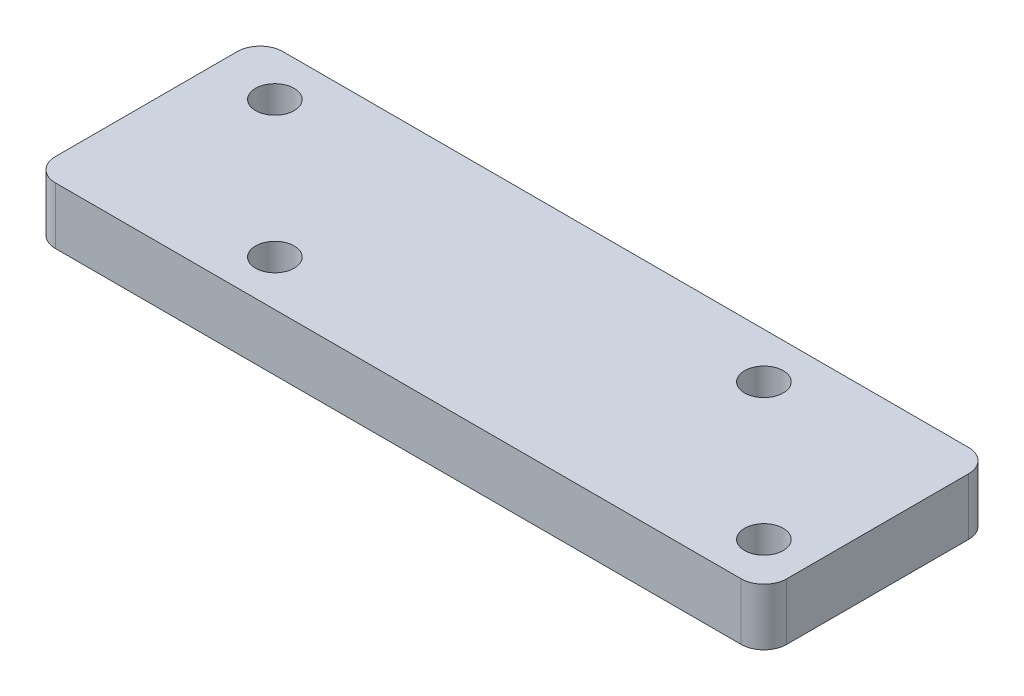
ISO-10303-21;
HEADER;
FILE_DESCRIPTION(('STEP AP214'),'2;1');
FILE_NAME('part.step','',(''),(''),'','','');
FILE_SCHEMA(('AUTOMOTIVE_DESIGN { 1 0 10303 214 1 1 1 1 }'));
ENDSEC;
DATA;
#1=APPLICATION_CONTEXT('core data for automotive mechanical design processes');
#2=APPLICATION_PROTOCOL_DEFINITION('international standard','automotive_design',2000,#1);
#3=PRODUCT_CONTEXT('',#1,'mechanical');
#4=PRODUCT('Part','Part','',(#3));
#5=PRODUCT_RELATED_PRODUCT_CATEGORY('part','',(#4));
#6=PRODUCT_DEFINITION_FORMATION('','',#4);
#7=PRODUCT_DEFINITION_CONTEXT('part definition',#1,'design');
#8=PRODUCT_DEFINITION('design','',#6,#7);
#9=PRODUCT_DEFINITION_SHAPE('','',#8);
#10=(LENGTH_UNIT() NAMED_UNIT(*) SI_UNIT(.MILLI.,.METRE.));
#11=(NAMED_UNIT(*) PLANE_ANGLE_UNIT() SI_UNIT($,.RADIAN.));
#12=(NAMED_UNIT(*) SI_UNIT($,.STERADIAN.) SOLID_ANGLE_UNIT());
#13=UNCERTAINTY_MEASURE_WITH_UNIT(LENGTH_MEASURE(1.E-05),#10,'distance_accuracy_value','');
#14=(GEOMETRIC_REPRESENTATION_CONTEXT(3) GLOBAL_UNCERTAINTY_ASSIGNED_CONTEXT((#13)) GLOBAL_UNIT_ASSIGNED_CONTEXT((#10,
#11,#12)) REPRESENTATION_CONTEXT('',''));
#15=CARTESIAN_POINT('',(0.,0.,0.));
#16=DIRECTION('',(0.,0.,1.));
#17=DIRECTION('',(1.,0.,0.));
#18=AXIS2_PLACEMENT_3D('',#15,#16,#17);
#19=CARTESIAN_POINT('',(0.,5.,0.));
#20=DIRECTION('',(0.,-1.,0.));
#21=DIRECTION('',(0.,0.,-1.));
#22=AXIS2_PLACEMENT_3D('',#19,#20,#21);
#23=PLANE('',#22);
#24=DIRECTION('',(-1.,0.,0.));
#25=VECTOR('',#24,1.);
#26=CARTESIAN_POINT('',(0.,5.,-20.));
#27=LINE('',#26,#25);
#28=CARTESIAN_POINT('',(62.3,5.,-20.));
#29=VERTEX_POINT('',#28);
#30=CARTESIAN_POINT('',(2.,5.,-20.));
#31=VERTEX_POINT('',#30);
#32=EDGE_CURVE('E152',#29,#31,#27,.T.);
#33=ORIENTED_EDGE('',*,*,#32,.T.);
#34=CARTESIAN_POINT('',(2.,5.,-18.));
#35=DIRECTION('',(0.,-1.,0.));
#36=DIRECTION('',(0.,0.,-1.));
#37=AXIS2_PLACEMENT_3D('',#34,#35,#36);
#38=CIRCLE('',#37,2.);
#39=CARTESIAN_POINT('',(0.,5.,-18.));
#40=VERTEX_POINT('',#39);
#41=EDGE_CURVE('E184',#31,#40,#38,.F.);
#42=ORIENTED_EDGE('',*,*,#41,.T.);
#43=DIRECTION('',(0.,0.,1.));
#44=VECTOR('',#43,1.);
#45=CARTESIAN_POINT('',(0.,5.,0.));
#46=LINE('',#45,#44);
#47=CARTESIAN_POINT('',(0.,5.,-2.));
#48=VERTEX_POINT('',#47);
#49=EDGE_CURVE('E131',#40,#48,#46,.T.);
#50=ORIENTED_EDGE('',*,*,#49,.T.);
#51=CARTESIAN_POINT('',(2.,5.,-2.));
#52=DIRECTION('',(0.,-1.,0.));
#53=DIRECTION('',(0.,0.,-1.));
#54=AXIS2_PLACEMENT_3D('',#51,#52,#53);
#55=CIRCLE('',#54,2.);
#56=CARTESIAN_POINT('',(2.,5.,0.));
#57=VERTEX_POINT('',#56);
#58=EDGE_CURVE('E177',#48,#57,#55,.F.);
#59=ORIENTED_EDGE('',*,*,#58,.T.);
#60=DIRECTION('',(1.,0.,0.));
#61=VECTOR('',#60,1.);
#62=CARTESIAN_POINT('',(0.,5.,0.));
#63=LINE('',#62,#61);
#64=CARTESIAN_POINT('',(62.3,5.,0.));
#65=VERTEX_POINT('',#64);
#66=EDGE_CURVE('E200',#57,#65,#63,.T.);
#67=ORIENTED_EDGE('',*,*,#66,.T.);
#68=CARTESIAN_POINT('',(62.3,5.,-2.));
#69=DIRECTION('',(0.,-1.,0.));
#70=DIRECTION('',(0.,0.,-1.));
#71=AXIS2_PLACEMENT_3D('',#68,#69,#70);
#72=CIRCLE('',#71,2.);
#73=CARTESIAN_POINT('',(64.3,5.,-2.));
#74=VERTEX_POINT('',#73);
#75=EDGE_CURVE('E70',#65,#74,#72,.F.);
#76=ORIENTED_EDGE('',*,*,#75,.T.);
#77=DIRECTION('',(0.,0.,-1.));
#78=VECTOR('',#77,1.);
#79=CARTESIAN_POINT('',(64.3,5.,0.));
#80=LINE('',#79,#78);
#81=CARTESIAN_POINT('',(64.3,5.,-18.));
#82=VERTEX_POINT('',#81);
#83=EDGE_CURVE('E210',#74,#82,#80,.T.);
#84=ORIENTED_EDGE('',*,*,#83,.T.);
#85=CARTESIAN_POINT('',(62.3,5.,-18.));
#86=DIRECTION('',(0.,-1.,0.));
#87=DIRECTION('',(0.,0.,-1.));
#88=AXIS2_PLACEMENT_3D('',#85,#86,#87);
#89=CIRCLE('',#88,2.);
#90=EDGE_CURVE('E182',#82,#29,#89,.F.);
#91=ORIENTED_EDGE('',*,*,#90,.T.);
#92=EDGE_LOOP('',(#33,#42,#50,#59,#67,#76,#84,#91));
#93=FACE_BOUND('',#92,.T.);
#94=CARTESIAN_POINT('',(5.3,5.,-16.));
#95=DIRECTION('',(0.,1.,0.));
#96=DIRECTION('',(0.,0.,1.));
#97=AXIS2_PLACEMENT_3D('',#94,#95,#96);
#98=CIRCLE('',#97,1.7);
#99=CARTESIAN_POINT('',(5.3,5.,-14.3));
#100=VERTEX_POINT('',#99);
#101=EDGE_CURVE('E141',#100,#100,#98,.T.);
#102=ORIENTED_EDGE('',*,*,#101,.F.);
#103=EDGE_LOOP('',(#102));
#104=FACE_BOUND('',#103,.T.);
#105=CARTESIAN_POINT('',(17.3,5.,-4.));
#106=DIRECTION('',(0.,1.,0.));
#107=DIRECTION('',(0.,0.,1.));
#108=AXIS2_PLACEMENT_3D('',#105,#106,#107);
#109=CIRCLE('',#108,1.7);
#110=CARTESIAN_POINT('',(17.3,5.,-2.3));
#111=VERTEX_POINT('',#110);
#112=EDGE_CURVE('E218',#111,#111,#109,.T.);
#113=ORIENTED_EDGE('',*,*,#112,.F.);
#114=EDGE_LOOP('',(#113));
#115=FACE_BOUND('',#114,.T.);
#116=CARTESIAN_POINT('',(48.3,5.,-16.));
#117=DIRECTION('',(0.,1.,0.));
#118=DIRECTION('',(0.,0.,1.));
#119=AXIS2_PLACEMENT_3D('',#116,#117,#118);
#120=CIRCLE('',#119,1.7);
#121=CARTESIAN_POINT('',(48.3,5.,-14.3));
#122=VERTEX_POINT('',#121);
#123=EDGE_CURVE('E223',#122,#122,#120,.T.);
#124=ORIENTED_EDGE('',*,*,#123,.F.);
#125=EDGE_LOOP('',(#124));
#126=FACE_BOUND('',#125,.T.);
#127=CARTESIAN_POINT('',(60.3,5.,-4.));
#128=DIRECTION('',(0.,1.,0.));
#129=DIRECTION('',(0.,0.,1.));
#130=AXIS2_PLACEMENT_3D('',#127,#128,#129);
#131=CIRCLE('',#130,1.7);
#132=CARTESIAN_POINT('',(60.3,5.,-2.3));
#133=VERTEX_POINT('',#132);
#134=EDGE_CURVE('E235',#133,#133,#131,.T.);
#135=ORIENTED_EDGE('',*,*,#134,.F.);
#136=EDGE_LOOP('',(#135));
#137=FACE_BOUND('',#136,.T.);
#138=ADVANCED_FACE('F44',(#93,#104,#115,#126,#137),#23,.F.);
#139=CARTESIAN_POINT('',(0.,0.,0.));
#140=DIRECTION('',(0.,-1.,0.));
#141=DIRECTION('',(0.,0.,-1.));
#142=AXIS2_PLACEMENT_3D('',#139,#140,#141);
#143=PLANE('',#142);
#144=CARTESIAN_POINT('',(48.3,0.,-16.));
#145=DIRECTION('',(0.,1.,0.));
#146=DIRECTION('',(0.,0.,1.));
#147=AXIS2_PLACEMENT_3D('',#144,#145,#146);
#148=CIRCLE('',#147,1.7);
#149=CARTESIAN_POINT('',(48.3,0.,-14.3));
#150=VERTEX_POINT('',#149);
#151=EDGE_CURVE('E227',#150,#150,#148,.T.);
#152=ORIENTED_EDGE('',*,*,#151,.T.);
#153=EDGE_LOOP('',(#152));
#154=FACE_BOUND('',#153,.T.);
#155=CARTESIAN_POINT('',(5.3,0.,-16.));
#156=DIRECTION('',(0.,1.,0.));
#157=DIRECTION('',(0.,0.,1.));
#158=AXIS2_PLACEMENT_3D('',#155,#156,#157);
#159=CIRCLE('',#158,1.7);
#160=CARTESIAN_POINT('',(5.3,0.,-14.3));
#161=VERTEX_POINT('',#160);
#162=EDGE_CURVE('E151',#161,#161,#159,.T.);
#163=ORIENTED_EDGE('',*,*,#162,.T.);
#164=EDGE_LOOP('',(#163));
#165=FACE_BOUND('',#164,.T.);
#166=DIRECTION('',(0.,0.,1.));
#167=VECTOR('',#166,1.);
#168=CARTESIAN_POINT('',(0.,0.,0.));
#169=LINE('',#168,#167);
#170=CARTESIAN_POINT('',(0.,0.,-18.));
#171=VERTEX_POINT('',#170);
#172=CARTESIAN_POINT('',(0.,0.,-2.));
#173=VERTEX_POINT('',#172);
#174=EDGE_CURVE('E128',#171,#173,#169,.T.);
#175=ORIENTED_EDGE('',*,*,#174,.F.);
#176=CARTESIAN_POINT('',(2.,0.,-18.));
#177=DIRECTION('',(0.,-1.,0.));
#178=DIRECTION('',(0.,0.,-1.));
#179=AXIS2_PLACEMENT_3D('',#176,#177,#178);
#180=CIRCLE('',#179,2.);
#181=CARTESIAN_POINT('',(2.,0.,-20.));
#182=VERTEX_POINT('',#181);
#183=EDGE_CURVE('E115',#171,#182,#180,.T.);
#184=ORIENTED_EDGE('',*,*,#183,.T.);
#185=DIRECTION('',(-1.,0.,0.));
#186=VECTOR('',#185,1.);
#187=CARTESIAN_POINT('',(0.,0.,-20.));
#188=LINE('',#187,#186);
#189=CARTESIAN_POINT('',(62.3,0.,-20.));
#190=VERTEX_POINT('',#189);
#191=EDGE_CURVE('E157',#190,#182,#188,.T.);
#192=ORIENTED_EDGE('',*,*,#191,.F.);
#193=CARTESIAN_POINT('',(62.3,0.,-18.));
#194=DIRECTION('',(0.,-1.,0.));
#195=DIRECTION('',(0.,0.,-1.));
#196=AXIS2_PLACEMENT_3D('',#193,#194,#195);
#197=CIRCLE('',#196,2.);
#198=CARTESIAN_POINT('',(64.3,0.,-18.));
#199=VERTEX_POINT('',#198);
#200=EDGE_CURVE('E121',#190,#199,#197,.T.);
#201=ORIENTED_EDGE('',*,*,#200,.T.);
#202=DIRECTION('',(0.,0.,-1.));
#203=VECTOR('',#202,1.);
#204=CARTESIAN_POINT('',(64.3,0.,0.));
#205=LINE('',#204,#203);
#206=CARTESIAN_POINT('',(64.3,0.,-2.));
#207=VERTEX_POINT('',#206);
#208=EDGE_CURVE('E146',#207,#199,#205,.T.);
#209=ORIENTED_EDGE('',*,*,#208,.F.);
#210=CARTESIAN_POINT('',(62.3,0.,-2.));
#211=DIRECTION('',(0.,-1.,0.));
#212=DIRECTION('',(0.,0.,-1.));
#213=AXIS2_PLACEMENT_3D('',#210,#211,#212);
#214=CIRCLE('',#213,2.);
#215=CARTESIAN_POINT('',(62.3,0.,0.));
#216=VERTEX_POINT('',#215);
#217=EDGE_CURVE('E167',#207,#216,#214,.T.);
#218=ORIENTED_EDGE('',*,*,#217,.T.);
#219=DIRECTION('',(1.,0.,0.));
#220=VECTOR('',#219,1.);
#221=CARTESIAN_POINT('',(0.,0.,0.));
#222=LINE('',#221,#220);
#223=CARTESIAN_POINT('',(2.,0.,0.));
#224=VERTEX_POINT('',#223);
#225=EDGE_CURVE('E142',#224,#216,#222,.T.);
#226=ORIENTED_EDGE('',*,*,#225,.F.);
#227=CARTESIAN_POINT('',(2.,0.,-2.));
#228=DIRECTION('',(0.,-1.,0.));
#229=DIRECTION('',(0.,0.,-1.));
#230=AXIS2_PLACEMENT_3D('',#227,#228,#229);
#231=CIRCLE('',#230,2.);
#232=EDGE_CURVE('E134',#224,#173,#231,.T.);
#233=ORIENTED_EDGE('',*,*,#232,.T.);
#234=EDGE_LOOP('',(#175,#184,#192,#201,#209,#218,#226,#233));
#235=FACE_BOUND('',#234,.T.);
#236=CARTESIAN_POINT('',(17.3,0.,-4.));
#237=DIRECTION('',(0.,1.,0.));
#238=DIRECTION('',(0.,0.,1.));
#239=AXIS2_PLACEMENT_3D('',#236,#237,#238);
#240=CIRCLE('',#239,1.7);
#241=CARTESIAN_POINT('',(17.3,0.,-2.3));
#242=VERTEX_POINT('',#241);
#243=EDGE_CURVE('E222',#242,#242,#240,.T.);
#244=ORIENTED_EDGE('',*,*,#243,.T.);
#245=EDGE_LOOP('',(#244));
#246=FACE_BOUND('',#245,.T.);
#247=CARTESIAN_POINT('',(60.3,0.,-4.));
#248=DIRECTION('',(0.,1.,0.));
#249=DIRECTION('',(0.,0.,1.));
#250=AXIS2_PLACEMENT_3D('',#247,#248,#249);
#251=CIRCLE('',#250,1.7);
#252=CARTESIAN_POINT('',(60.3,0.,-2.3));
#253=VERTEX_POINT('',#252);
#254=EDGE_CURVE('E240',#253,#253,#251,.T.);
#255=ORIENTED_EDGE('',*,*,#254,.T.);
#256=EDGE_LOOP('',(#255));
#257=FACE_BOUND('',#256,.T.);
#258=ADVANCED_FACE('F140',(#154,#165,#235,#246,#257),#143,.T.);
#259=CARTESIAN_POINT('',(0.,5.,0.));
#260=DIRECTION('',(1.,0.,0.));
#261=DIRECTION('',(0.,0.,-1.));
#262=AXIS2_PLACEMENT_3D('',#259,#260,#261);
#263=PLANE('',#262);
#264=ORIENTED_EDGE('',*,*,#49,.F.);
#265=DIRECTION('',(0.,-1.,0.));
#266=VECTOR('',#265,1.);
#267=CARTESIAN_POINT('',(0.,5.,-18.));
#268=LINE('',#267,#266);
#269=EDGE_CURVE('E118',#40,#171,#268,.T.);
#270=ORIENTED_EDGE('',*,*,#269,.T.);
#271=ORIENTED_EDGE('',*,*,#174,.T.);
#272=DIRECTION('',(0.,-1.,0.));
#273=VECTOR('',#272,1.);
#274=CARTESIAN_POINT('',(0.,5.,-2.));
#275=LINE('',#274,#273);
#276=EDGE_CURVE('E137',#173,#48,#275,.F.);
#277=ORIENTED_EDGE('',*,*,#276,.T.);
#278=EDGE_LOOP('',(#264,#270,#271,#277));
#279=FACE_BOUND('',#278,.T.);
#280=ADVANCED_FACE('F129',(#279),#263,.F.);
#281=CARTESIAN_POINT('',(0.,5.,0.));
#282=DIRECTION('',(0.,0.,-1.));
#283=DIRECTION('',(-1.,0.,0.));
#284=AXIS2_PLACEMENT_3D('',#281,#282,#283);
#285=PLANE('',#284);
#286=ORIENTED_EDGE('',*,*,#225,.T.);
#287=DIRECTION('',(0.,-1.,0.));
#288=VECTOR('',#287,1.);
#289=CARTESIAN_POINT('',(62.3,5.,0.));
#290=LINE('',#289,#288);
#291=EDGE_CURVE('E11',#216,#65,#290,.F.);
#292=ORIENTED_EDGE('',*,*,#291,.T.);
#293=ORIENTED_EDGE('',*,*,#66,.F.);
#294=DIRECTION('',(0.,-1.,0.));
#295=VECTOR('',#294,1.);
#296=CARTESIAN_POINT('',(2.,5.,0.));
#297=LINE('',#296,#295);
#298=EDGE_CURVE('E53',#57,#224,#297,.T.);
#299=ORIENTED_EDGE('',*,*,#298,.T.);
#300=EDGE_LOOP('',(#286,#292,#293,#299));
#301=FACE_BOUND('',#300,.T.);
#302=ADVANCED_FACE('F197',(#301),#285,.F.);
#303=CARTESIAN_POINT('',(64.3,5.,0.));
#304=DIRECTION('',(-1.,0.,0.));
#305=DIRECTION('',(0.,0.,1.));
#306=AXIS2_PLACEMENT_3D('',#303,#304,#305);
#307=PLANE('',#306);
#308=ORIENTED_EDGE('',*,*,#208,.T.);
#309=DIRECTION('',(0.,-1.,0.));
#310=VECTOR('',#309,1.);
#311=CARTESIAN_POINT('',(64.3,5.,-18.));
#312=LINE('',#311,#310);
#313=EDGE_CURVE('E63',#199,#82,#312,.F.);
#314=ORIENTED_EDGE('',*,*,#313,.T.);
#315=ORIENTED_EDGE('',*,*,#83,.F.);
#316=DIRECTION('',(0.,-1.,0.));
#317=VECTOR('',#316,1.);
#318=CARTESIAN_POINT('',(64.3,5.,-2.));
#319=LINE('',#318,#317);
#320=EDGE_CURVE('E190',#74,#207,#319,.T.);
#321=ORIENTED_EDGE('',*,*,#320,.T.);
#322=EDGE_LOOP('',(#308,#314,#315,#321));
#323=FACE_BOUND('',#322,.T.);
#324=ADVANCED_FACE('F206',(#323),#307,.F.);
#325=CARTESIAN_POINT('',(0.,5.,-20.));
#326=DIRECTION('',(0.,0.,1.));
#327=DIRECTION('',(1.,0.,0.));
#328=AXIS2_PLACEMENT_3D('',#325,#326,#327);
#329=PLANE('',#328);
#330=ORIENTED_EDGE('',*,*,#191,.T.);
#331=DIRECTION('',(0.,-1.,0.));
#332=VECTOR('',#331,1.);
#333=CARTESIAN_POINT('',(2.,5.,-20.));
#334=LINE('',#333,#332);
#335=EDGE_CURVE('E120',#182,#31,#334,.F.);
#336=ORIENTED_EDGE('',*,*,#335,.T.);
#337=ORIENTED_EDGE('',*,*,#32,.F.);
#338=DIRECTION('',(0.,-1.,0.));
#339=VECTOR('',#338,1.);
#340=CARTESIAN_POINT('',(62.3,5.,-20.));
#341=LINE('',#340,#339);
#342=EDGE_CURVE('E125',#29,#190,#341,.T.);
#343=ORIENTED_EDGE('',*,*,#342,.T.);
#344=EDGE_LOOP('',(#330,#336,#337,#343));
#345=FACE_BOUND('',#344,.T.);
#346=ADVANCED_FACE('F261',(#345),#329,.F.);
#347=CARTESIAN_POINT('',(5.3,5.,-16.));
#348=DIRECTION('',(0.,-1.,0.));
#349=DIRECTION('',(0.,0.,-1.));
#350=AXIS2_PLACEMENT_3D('',#347,#348,#349);
#351=CYLINDRICAL_SURFACE('',#350,1.7);
#352=ORIENTED_EDGE('',*,*,#101,.T.);
#353=EDGE_LOOP('',(#352));
#354=FACE_BOUND('',#353,.T.);
#355=ORIENTED_EDGE('',*,*,#162,.F.);
#356=EDGE_LOOP('',(#355));
#357=FACE_BOUND('',#356,.T.);
#358=ADVANCED_FACE('F256',(#354,#357),#351,.F.);
#359=CARTESIAN_POINT('',(17.3,5.,-4.));
#360=DIRECTION('',(0.,-1.,0.));
#361=DIRECTION('',(0.,0.,-1.));
#362=AXIS2_PLACEMENT_3D('',#359,#360,#361);
#363=CYLINDRICAL_SURFACE('',#362,1.7);
#364=ORIENTED_EDGE('',*,*,#112,.T.);
#365=EDGE_LOOP('',(#364));
#366=FACE_BOUND('',#365,.T.);
#367=ORIENTED_EDGE('',*,*,#243,.F.);
#368=EDGE_LOOP('',(#367));
#369=FACE_BOUND('',#368,.T.);
#370=ADVANCED_FACE('F318',(#366,#369),#363,.F.);
#371=CARTESIAN_POINT('',(48.3,5.,-16.));
#372=DIRECTION('',(0.,-1.,0.));
#373=DIRECTION('',(0.,0.,-1.));
#374=AXIS2_PLACEMENT_3D('',#371,#372,#373);
#375=CYLINDRICAL_SURFACE('',#374,1.7);
#376=ORIENTED_EDGE('',*,*,#123,.T.);
#377=EDGE_LOOP('',(#376));
#378=FACE_BOUND('',#377,.T.);
#379=ORIENTED_EDGE('',*,*,#151,.F.);
#380=EDGE_LOOP('',(#379));
#381=FACE_BOUND('',#380,.T.);
#382=ADVANCED_FACE('F310',(#378,#381),#375,.F.);
#383=CARTESIAN_POINT('',(60.3,5.,-4.));
#384=DIRECTION('',(0.,-1.,0.));
#385=DIRECTION('',(0.,0.,-1.));
#386=AXIS2_PLACEMENT_3D('',#383,#384,#385);
#387=CYLINDRICAL_SURFACE('',#386,1.7);
#388=ORIENTED_EDGE('',*,*,#134,.T.);
#389=EDGE_LOOP('',(#388));
#390=FACE_BOUND('',#389,.T.);
#391=ORIENTED_EDGE('',*,*,#254,.F.);
#392=EDGE_LOOP('',(#391));
#393=FACE_BOUND('',#392,.T.);
#394=ADVANCED_FACE('F244',(#390,#393),#387,.F.);
#395=CARTESIAN_POINT('',(2.,5.,-18.));
#396=DIRECTION('',(0.,-1.,0.));
#397=DIRECTION('',(0.,0.,-1.));
#398=AXIS2_PLACEMENT_3D('',#395,#396,#397);
#399=CYLINDRICAL_SURFACE('',#398,2.);
#400=ORIENTED_EDGE('',*,*,#41,.F.);
#401=ORIENTED_EDGE('',*,*,#335,.F.);
#402=ORIENTED_EDGE('',*,*,#183,.F.);
#403=ORIENTED_EDGE('',*,*,#269,.F.);
#404=EDGE_LOOP('',(#400,#401,#402,#403));
#405=FACE_BOUND('',#404,.T.);
#406=ADVANCED_FACE('F113',(#405),#399,.T.);
#407=CARTESIAN_POINT('',(62.3,5.,-18.));
#408=DIRECTION('',(0.,-1.,0.));
#409=DIRECTION('',(0.,0.,-1.));
#410=AXIS2_PLACEMENT_3D('',#407,#408,#409);
#411=CYLINDRICAL_SURFACE('',#410,2.);
#412=ORIENTED_EDGE('',*,*,#90,.F.);
#413=ORIENTED_EDGE('',*,*,#313,.F.);
#414=ORIENTED_EDGE('',*,*,#200,.F.);
#415=ORIENTED_EDGE('',*,*,#342,.F.);
#416=EDGE_LOOP('',(#412,#413,#414,#415));
#417=FACE_BOUND('',#416,.T.);
#418=ADVANCED_FACE('F272',(#417),#411,.T.);
#419=CARTESIAN_POINT('',(62.3,5.,-2.));
#420=DIRECTION('',(0.,-1.,0.));
#421=DIRECTION('',(0.,0.,-1.));
#422=AXIS2_PLACEMENT_3D('',#419,#420,#421);
#423=CYLINDRICAL_SURFACE('',#422,2.);
#424=ORIENTED_EDGE('',*,*,#75,.F.);
#425=ORIENTED_EDGE('',*,*,#291,.F.);
#426=ORIENTED_EDGE('',*,*,#217,.F.);
#427=ORIENTED_EDGE('',*,*,#320,.F.);
#428=EDGE_LOOP('',(#424,#425,#426,#427));
#429=FACE_BOUND('',#428,.T.);
#430=ADVANCED_FACE('F202',(#429),#423,.T.);
#431=CARTESIAN_POINT('',(2.,5.,-2.));
#432=DIRECTION('',(0.,-1.,0.));
#433=DIRECTION('',(0.,0.,-1.));
#434=AXIS2_PLACEMENT_3D('',#431,#432,#433);
#435=CYLINDRICAL_SURFACE('',#434,2.);
#436=ORIENTED_EDGE('',*,*,#58,.F.);
#437=ORIENTED_EDGE('',*,*,#276,.F.);
#438=ORIENTED_EDGE('',*,*,#232,.F.);
#439=ORIENTED_EDGE('',*,*,#298,.F.);
#440=EDGE_LOOP('',(#436,#437,#438,#439));
#441=FACE_BOUND('',#440,.T.);
#442=ADVANCED_FACE('F50',(#441),#435,.T.);
#443=CLOSED_SHELL('',(#138,#258,#280,#302,#324,#346,#358,#370,#382,#394,#406,#418,#430,#442));
#444=MANIFOLD_SOLID_BREP('B2',#443);
#445=ADVANCED_BREP_SHAPE_REPRESENTATION('',(#18,#444),#14);
#446=SHAPE_DEFINITION_REPRESENTATION(#9,#445);
ENDSEC;
END-ISO-10303-21;
